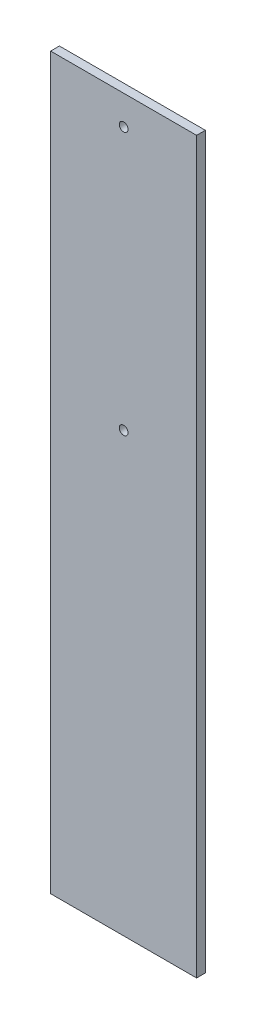
ISO-10303-21;
HEADER;
FILE_DESCRIPTION(('STEP AP214'),'2;1');
FILE_NAME('part.step','',(''),(''),'','','');
FILE_SCHEMA(('AUTOMOTIVE_DESIGN { 1 0 10303 214 1 1 1 1 }'));
ENDSEC;
DATA;
#1=APPLICATION_CONTEXT('core data for automotive mechanical design processes');
#2=APPLICATION_PROTOCOL_DEFINITION('international standard','automotive_design',2000,#1);
#3=PRODUCT_CONTEXT('',#1,'mechanical');
#4=PRODUCT('Part','Part','',(#3));
#5=PRODUCT_RELATED_PRODUCT_CATEGORY('part','',(#4));
#6=PRODUCT_DEFINITION_FORMATION('','',#4);
#7=PRODUCT_DEFINITION_CONTEXT('part definition',#1,'design');
#8=PRODUCT_DEFINITION('design','',#6,#7);
#9=PRODUCT_DEFINITION_SHAPE('','',#8);
#10=(LENGTH_UNIT() NAMED_UNIT(*) SI_UNIT(.MILLI.,.METRE.));
#11=(NAMED_UNIT(*) PLANE_ANGLE_UNIT() SI_UNIT($,.RADIAN.));
#12=(NAMED_UNIT(*) SI_UNIT($,.STERADIAN.) SOLID_ANGLE_UNIT());
#13=UNCERTAINTY_MEASURE_WITH_UNIT(LENGTH_MEASURE(1.E-05),#10,'distance_accuracy_value','');
#14=(GEOMETRIC_REPRESENTATION_CONTEXT(3) GLOBAL_UNCERTAINTY_ASSIGNED_CONTEXT((#13)) GLOBAL_UNIT_ASSIGNED_CONTEXT((#10,
#11,#12)) REPRESENTATION_CONTEXT('',''));
#15=CARTESIAN_POINT('',(0.,0.,0.));
#16=DIRECTION('',(0.,0.,1.));
#17=DIRECTION('',(1.,0.,0.));
#18=AXIS2_PLACEMENT_3D('',#15,#16,#17);
#19=CARTESIAN_POINT('',(0.,0.,3.));
#20=DIRECTION('',(0.,0.,-1.));
#21=DIRECTION('',(-1.,0.,0.));
#22=AXIS2_PLACEMENT_3D('',#19,#20,#21);
#23=PLANE('',#22);
#24=DIRECTION('',(1.,0.,0.));
#25=VECTOR('',#24,1.);
#26=CARTESIAN_POINT('',(-25.,125.,3.));
#27=LINE('',#26,#25);
#28=CARTESIAN_POINT('',(-25.,125.,3.));
#29=VERTEX_POINT('',#28);
#30=CARTESIAN_POINT('',(25.,125.,3.));
#31=VERTEX_POINT('',#30);
#32=EDGE_CURVE('E124',#29,#31,#27,.T.);
#33=ORIENTED_EDGE('',*,*,#32,.F.);
#34=DIRECTION('',(0.,-1.,0.));
#35=VECTOR('',#34,1.);
#36=CARTESIAN_POINT('',(-25.,125.,3.));
#37=LINE('',#36,#35);
#38=CARTESIAN_POINT('',(-25.,-125.,3.));
#39=VERTEX_POINT('',#38);
#40=EDGE_CURVE('E114',#29,#39,#37,.T.);
#41=ORIENTED_EDGE('',*,*,#40,.T.);
#42=DIRECTION('',(1.,0.,0.));
#43=VECTOR('',#42,1.);
#44=CARTESIAN_POINT('',(-25.,-125.,3.));
#45=LINE('',#44,#43);
#46=CARTESIAN_POINT('',(25.,-125.,3.));
#47=VERTEX_POINT('',#46);
#48=EDGE_CURVE('E109',#39,#47,#45,.T.);
#49=ORIENTED_EDGE('',*,*,#48,.T.);
#50=DIRECTION('',(0.,-1.,0.));
#51=VECTOR('',#50,1.);
#52=CARTESIAN_POINT('',(25.,125.,3.));
#53=LINE('',#52,#51);
#54=EDGE_CURVE('E113',#31,#47,#53,.T.);
#55=ORIENTED_EDGE('',*,*,#54,.F.);
#56=EDGE_LOOP('',(#33,#41,#49,#55));
#57=FACE_BOUND('',#56,.T.);
#58=CARTESIAN_POINT('',(0.,115.,3.));
#59=DIRECTION('',(0.,0.,1.));
#60=DIRECTION('',(1.,0.,0.));
#61=AXIS2_PLACEMENT_3D('',#58,#59,#60);
#62=CIRCLE('',#61,1.5);
#63=CARTESIAN_POINT('',(1.49999999999999,115.,3.));
#64=VERTEX_POINT('',#63);
#65=EDGE_CURVE('E134',#64,#64,#62,.T.);
#66=ORIENTED_EDGE('',*,*,#65,.F.);
#67=EDGE_LOOP('',(#66));
#68=FACE_BOUND('',#67,.T.);
#69=CARTESIAN_POINT('',(0.,25.,3.));
#70=DIRECTION('',(0.,0.,1.));
#71=DIRECTION('',(1.,0.,0.));
#72=AXIS2_PLACEMENT_3D('',#69,#70,#71);
#73=CIRCLE('',#72,1.5);
#74=CARTESIAN_POINT('',(1.49999999999999,25.,3.));
#75=VERTEX_POINT('',#74);
#76=EDGE_CURVE('E175',#75,#75,#73,.T.);
#77=ORIENTED_EDGE('',*,*,#76,.F.);
#78=EDGE_LOOP('',(#77));
#79=FACE_BOUND('',#78,.T.);
#80=ADVANCED_FACE('F63',(#57,#68,#79),#23,.F.);
#81=CARTESIAN_POINT('',(0.,0.,0.));
#82=DIRECTION('',(0.,0.,-1.));
#83=DIRECTION('',(-1.,0.,0.));
#84=AXIS2_PLACEMENT_3D('',#81,#82,#83);
#85=PLANE('',#84);
#86=CARTESIAN_POINT('',(0.,115.,0.));
#87=DIRECTION('',(0.,0.,1.));
#88=DIRECTION('',(1.,0.,0.));
#89=AXIS2_PLACEMENT_3D('',#86,#87,#88);
#90=CIRCLE('',#89,1.5);
#91=CARTESIAN_POINT('',(1.49999999999999,115.,0.));
#92=VERTEX_POINT('',#91);
#93=EDGE_CURVE('E174',#92,#92,#90,.T.);
#94=ORIENTED_EDGE('',*,*,#93,.T.);
#95=EDGE_LOOP('',(#94));
#96=FACE_BOUND('',#95,.T.);
#97=DIRECTION('',(1.,0.,0.));
#98=VECTOR('',#97,1.);
#99=CARTESIAN_POINT('',(-25.,125.,0.));
#100=LINE('',#99,#98);
#101=CARTESIAN_POINT('',(-25.,125.,0.));
#102=VERTEX_POINT('',#101);
#103=CARTESIAN_POINT('',(25.,125.,0.));
#104=VERTEX_POINT('',#103);
#105=EDGE_CURVE('E130',#102,#104,#100,.T.);
#106=ORIENTED_EDGE('',*,*,#105,.T.);
#107=DIRECTION('',(0.,-1.,0.));
#108=VECTOR('',#107,1.);
#109=CARTESIAN_POINT('',(25.,125.,0.));
#110=LINE('',#109,#108);
#111=CARTESIAN_POINT('',(25.,-125.,0.));
#112=VERTEX_POINT('',#111);
#113=EDGE_CURVE('E133',#104,#112,#110,.T.);
#114=ORIENTED_EDGE('',*,*,#113,.T.);
#115=DIRECTION('',(1.,0.,0.));
#116=VECTOR('',#115,1.);
#117=CARTESIAN_POINT('',(-25.,-125.,0.));
#118=LINE('',#117,#116);
#119=CARTESIAN_POINT('',(-25.,-125.,0.));
#120=VERTEX_POINT('',#119);
#121=EDGE_CURVE('E121',#120,#112,#118,.T.);
#122=ORIENTED_EDGE('',*,*,#121,.F.);
#123=DIRECTION('',(0.,-1.,0.));
#124=VECTOR('',#123,1.);
#125=CARTESIAN_POINT('',(-25.,125.,0.));
#126=LINE('',#125,#124);
#127=EDGE_CURVE('E97',#102,#120,#126,.T.);
#128=ORIENTED_EDGE('',*,*,#127,.F.);
#129=EDGE_LOOP('',(#106,#114,#122,#128));
#130=FACE_BOUND('',#129,.T.);
#131=CARTESIAN_POINT('',(0.,25.,0.));
#132=DIRECTION('',(0.,0.,1.));
#133=DIRECTION('',(1.,0.,0.));
#134=AXIS2_PLACEMENT_3D('',#131,#132,#133);
#135=CIRCLE('',#134,1.5);
#136=CARTESIAN_POINT('',(1.49999999999999,25.,0.));
#137=VERTEX_POINT('',#136);
#138=EDGE_CURVE('E178',#137,#137,#135,.T.);
#139=ORIENTED_EDGE('',*,*,#138,.T.);
#140=EDGE_LOOP('',(#139));
#141=FACE_BOUND('',#140,.T.);
#142=ADVANCED_FACE('F139',(#96,#130,#141),#85,.T.);
#143=CARTESIAN_POINT('',(-25.,125.,3.));
#144=DIRECTION('',(0.,1.,0.));
#145=DIRECTION('',(0.,0.,1.));
#146=AXIS2_PLACEMENT_3D('',#143,#144,#145);
#147=PLANE('',#146);
#148=ORIENTED_EDGE('',*,*,#105,.F.);
#149=DIRECTION('',(0.,0.,-1.));
#150=VECTOR('',#149,1.);
#151=CARTESIAN_POINT('',(-25.,125.,3.));
#152=LINE('',#151,#150);
#153=EDGE_CURVE('E12',#29,#102,#152,.T.);
#154=ORIENTED_EDGE('',*,*,#153,.F.);
#155=ORIENTED_EDGE('',*,*,#32,.T.);
#156=DIRECTION('',(0.,0.,-1.));
#157=VECTOR('',#156,1.);
#158=CARTESIAN_POINT('',(25.,125.,3.));
#159=LINE('',#158,#157);
#160=EDGE_CURVE('E67',#31,#104,#159,.T.);
#161=ORIENTED_EDGE('',*,*,#160,.T.);
#162=EDGE_LOOP('',(#148,#154,#155,#161));
#163=FACE_BOUND('',#162,.T.);
#164=ADVANCED_FACE('F65',(#163),#147,.T.);
#165=CARTESIAN_POINT('',(-25.,125.,3.));
#166=DIRECTION('',(1.,0.,0.));
#167=DIRECTION('',(0.,1.,0.));
#168=AXIS2_PLACEMENT_3D('',#165,#166,#167);
#169=PLANE('',#168);
#170=ORIENTED_EDGE('',*,*,#127,.T.);
#171=DIRECTION('',(0.,0.,-1.));
#172=VECTOR('',#171,1.);
#173=CARTESIAN_POINT('',(-25.,-125.,3.));
#174=LINE('',#173,#172);
#175=EDGE_CURVE('E73',#39,#120,#174,.T.);
#176=ORIENTED_EDGE('',*,*,#175,.F.);
#177=ORIENTED_EDGE('',*,*,#40,.F.);
#178=ORIENTED_EDGE('',*,*,#153,.T.);
#179=EDGE_LOOP('',(#170,#176,#177,#178));
#180=FACE_BOUND('',#179,.T.);
#181=ADVANCED_FACE('F142',(#180),#169,.F.);
#182=CARTESIAN_POINT('',(-25.,-125.,3.));
#183=DIRECTION('',(0.,1.,0.));
#184=DIRECTION('',(0.,0.,1.));
#185=AXIS2_PLACEMENT_3D('',#182,#183,#184);
#186=PLANE('',#185);
#187=ORIENTED_EDGE('',*,*,#121,.T.);
#188=DIRECTION('',(0.,0.,-1.));
#189=VECTOR('',#188,1.);
#190=CARTESIAN_POINT('',(25.,-125.,3.));
#191=LINE('',#190,#189);
#192=EDGE_CURVE('E118',#47,#112,#191,.T.);
#193=ORIENTED_EDGE('',*,*,#192,.F.);
#194=ORIENTED_EDGE('',*,*,#48,.F.);
#195=ORIENTED_EDGE('',*,*,#175,.T.);
#196=EDGE_LOOP('',(#187,#193,#194,#195));
#197=FACE_BOUND('',#196,.T.);
#198=ADVANCED_FACE('F119',(#197),#186,.F.);
#199=CARTESIAN_POINT('',(25.,125.,3.));
#200=DIRECTION('',(1.,0.,0.));
#201=DIRECTION('',(0.,1.,0.));
#202=AXIS2_PLACEMENT_3D('',#199,#200,#201);
#203=PLANE('',#202);
#204=ORIENTED_EDGE('',*,*,#113,.F.);
#205=ORIENTED_EDGE('',*,*,#160,.F.);
#206=ORIENTED_EDGE('',*,*,#54,.T.);
#207=ORIENTED_EDGE('',*,*,#192,.T.);
#208=EDGE_LOOP('',(#204,#205,#206,#207));
#209=FACE_BOUND('',#208,.T.);
#210=ADVANCED_FACE('F123',(#209),#203,.T.);
#211=CARTESIAN_POINT('',(0.,115.,3.));
#212=DIRECTION('',(0.,0.,-1.));
#213=DIRECTION('',(-1.,0.,0.));
#214=AXIS2_PLACEMENT_3D('',#211,#212,#213);
#215=CYLINDRICAL_SURFACE('',#214,1.5);
#216=ORIENTED_EDGE('',*,*,#65,.T.);
#217=EDGE_LOOP('',(#216));
#218=FACE_BOUND('',#217,.T.);
#219=ORIENTED_EDGE('',*,*,#93,.F.);
#220=EDGE_LOOP('',(#219));
#221=FACE_BOUND('',#220,.T.);
#222=ADVANCED_FACE('F155',(#218,#221),#215,.F.);
#223=CARTESIAN_POINT('',(0.,25.,3.));
#224=DIRECTION('',(0.,0.,-1.));
#225=DIRECTION('',(-1.,0.,0.));
#226=AXIS2_PLACEMENT_3D('',#223,#224,#225);
#227=CYLINDRICAL_SURFACE('',#226,1.5);
#228=ORIENTED_EDGE('',*,*,#76,.T.);
#229=EDGE_LOOP('',(#228));
#230=FACE_BOUND('',#229,.T.);
#231=ORIENTED_EDGE('',*,*,#138,.F.);
#232=EDGE_LOOP('',(#231));
#233=FACE_BOUND('',#232,.T.);
#234=ADVANCED_FACE('F163',(#230,#233),#227,.F.);
#235=CLOSED_SHELL('',(#80,#142,#164,#181,#198,#210,#222,#234));
#236=MANIFOLD_SOLID_BREP('B2',#235);
#237=ADVANCED_BREP_SHAPE_REPRESENTATION('',(#18,#236),#14);
#238=SHAPE_DEFINITION_REPRESENTATION(#9,#237);
ENDSEC;
END-ISO-10303-21;
